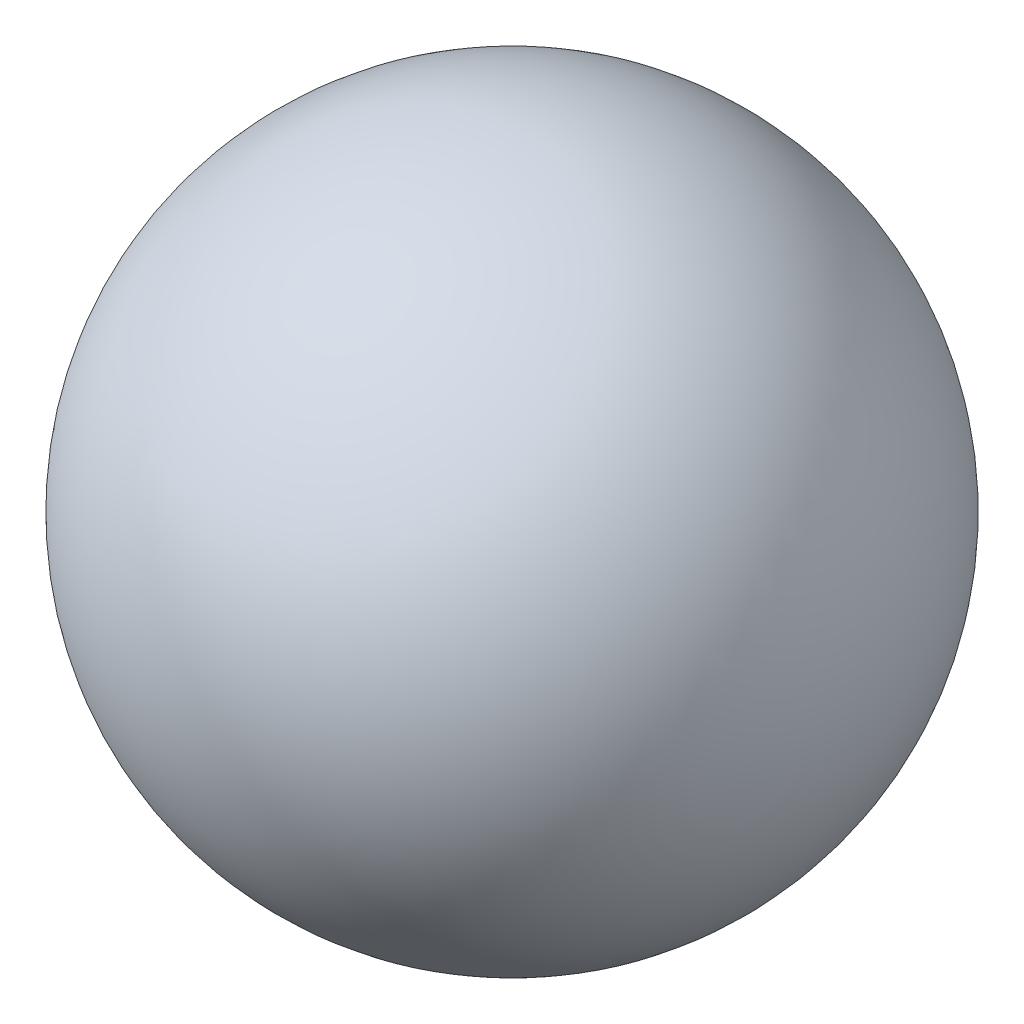
ISO-10303-21;
HEADER;
FILE_DESCRIPTION(('STEP AP214'),'2;1');
FILE_NAME('part.step','',(''),(''),'','','');
FILE_SCHEMA(('AUTOMOTIVE_DESIGN { 1 0 10303 214 1 1 1 1 }'));
ENDSEC;
DATA;
#1=APPLICATION_CONTEXT('core data for automotive mechanical design processes');
#2=APPLICATION_PROTOCOL_DEFINITION('international standard','automotive_design',2000,#1);
#3=PRODUCT_CONTEXT('',#1,'mechanical');
#4=PRODUCT('Part','Part','',(#3));
#5=PRODUCT_RELATED_PRODUCT_CATEGORY('part','',(#4));
#6=PRODUCT_DEFINITION_FORMATION('','',#4);
#7=PRODUCT_DEFINITION_CONTEXT('part definition',#1,'design');
#8=PRODUCT_DEFINITION('design','',#6,#7);
#9=PRODUCT_DEFINITION_SHAPE('','',#8);
#10=(LENGTH_UNIT() NAMED_UNIT(*) SI_UNIT(.MILLI.,.METRE.));
#11=(NAMED_UNIT(*) PLANE_ANGLE_UNIT() SI_UNIT($,.RADIAN.));
#12=(NAMED_UNIT(*) SI_UNIT($,.STERADIAN.) SOLID_ANGLE_UNIT());
#13=UNCERTAINTY_MEASURE_WITH_UNIT(LENGTH_MEASURE(1.E-05),#10,'distance_accuracy_value','');
#14=(GEOMETRIC_REPRESENTATION_CONTEXT(3) GLOBAL_UNCERTAINTY_ASSIGNED_CONTEXT((#13)) GLOBAL_UNIT_ASSIGNED_CONTEXT((#10,
#11,#12)) REPRESENTATION_CONTEXT('',''));
#15=CARTESIAN_POINT('',(0.,0.,0.));
#16=DIRECTION('',(0.,0.,1.));
#17=DIRECTION('',(1.,0.,0.));
#18=AXIS2_PLACEMENT_3D('',#15,#16,#17);
#19=CARTESIAN_POINT('',(0.,0.,0.));
#20=DIRECTION('',(0.,1.,0.));
#21=DIRECTION('',(1.,0.,0.));
#22=AXIS2_PLACEMENT_3D('',#19,#20,#21);
#23=SPHERICAL_SURFACE('',#22,42.4808362369338);
#24=CARTESIAN_POINT('',(0.,42.4808362369338,0.));
#25=VERTEX_POINT('',#24);
#26=VERTEX_LOOP('',#25);
#27=FACE_BOUND('',#26,.T.);
#28=ADVANCED_FACE('F39',(#27),#23,.T.);
#29=CLOSED_SHELL('',(#28));
#30=MANIFOLD_SOLID_BREP('B2',#29);
#31=ADVANCED_BREP_SHAPE_REPRESENTATION('',(#18,#30),#14);
#32=SHAPE_DEFINITION_REPRESENTATION(#9,#31);
ENDSEC;
END-ISO-10303-21;
